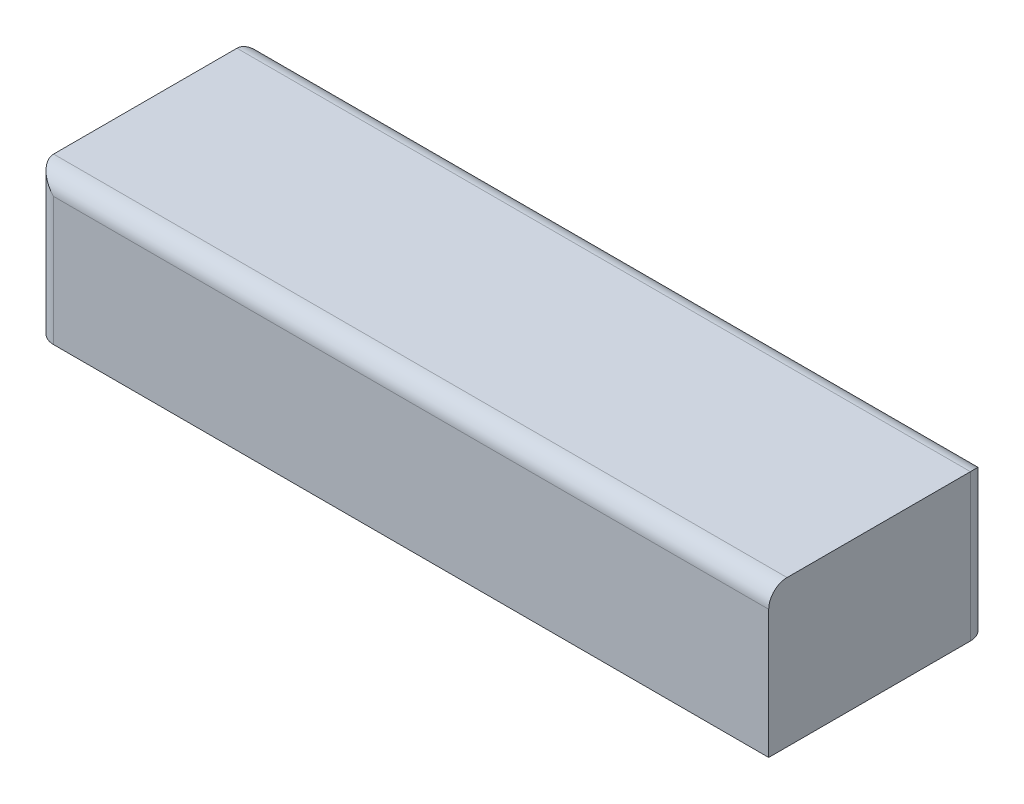
ISO-10303-21;
HEADER;
FILE_DESCRIPTION(('STEP AP214'),'2;1');
FILE_NAME('part.step','',(''),(''),'','','');
FILE_SCHEMA(('AUTOMOTIVE_DESIGN { 1 0 10303 214 1 1 1 1 }'));
ENDSEC;
DATA;
#1=APPLICATION_CONTEXT('core data for automotive mechanical design processes');
#2=APPLICATION_PROTOCOL_DEFINITION('international standard','automotive_design',2000,#1);
#3=PRODUCT_CONTEXT('',#1,'mechanical');
#4=PRODUCT('Part','Part','',(#3));
#5=PRODUCT_RELATED_PRODUCT_CATEGORY('part','',(#4));
#6=PRODUCT_DEFINITION_FORMATION('','',#4);
#7=PRODUCT_DEFINITION_CONTEXT('part definition',#1,'design');
#8=PRODUCT_DEFINITION('design','',#6,#7);
#9=PRODUCT_DEFINITION_SHAPE('','',#8);
#10=(LENGTH_UNIT() NAMED_UNIT(*) SI_UNIT(.MILLI.,.METRE.));
#11=(NAMED_UNIT(*) PLANE_ANGLE_UNIT() SI_UNIT($,.RADIAN.));
#12=(NAMED_UNIT(*) SI_UNIT($,.STERADIAN.) SOLID_ANGLE_UNIT());
#13=UNCERTAINTY_MEASURE_WITH_UNIT(LENGTH_MEASURE(1.E-05),#10,'distance_accuracy_value','');
#14=(GEOMETRIC_REPRESENTATION_CONTEXT(3) GLOBAL_UNCERTAINTY_ASSIGNED_CONTEXT((#13)) GLOBAL_UNIT_ASSIGNED_CONTEXT((#10,
#11,#12)) REPRESENTATION_CONTEXT('',''));
#15=CARTESIAN_POINT('',(0.,0.,0.));
#16=DIRECTION('',(0.,0.,1.));
#17=DIRECTION('',(1.,0.,0.));
#18=AXIS2_PLACEMENT_3D('',#15,#16,#17);
#19=CARTESIAN_POINT('',(0.,8.,0.));
#20=DIRECTION('',(1.,0.,0.));
#21=DIRECTION('',(0.,0.,-1.));
#22=AXIS2_PLACEMENT_3D('',#19,#20,#21);
#23=PLANE('',#22);
#24=DIRECTION('',(0.,0.,1.));
#25=VECTOR('',#24,1.);
#26=CARTESIAN_POINT('',(0.,0.,0.));
#27=LINE('',#26,#25);
#28=CARTESIAN_POINT('',(0.,0.,-11.));
#29=VERTEX_POINT('',#28);
#30=CARTESIAN_POINT('',(0.,0.,-1.));
#31=VERTEX_POINT('',#30);
#32=EDGE_CURVE('E113',#29,#31,#27,.T.);
#33=ORIENTED_EDGE('',*,*,#32,.T.);
#34=DIRECTION('',(0.,-1.,0.));
#35=VECTOR('',#34,1.);
#36=CARTESIAN_POINT('',(0.,8.,-1.));
#37=LINE('',#36,#35);
#38=CARTESIAN_POINT('',(0.,8.,-1.));
#39=VERTEX_POINT('',#38);
#40=EDGE_CURVE('E152',#31,#39,#37,.F.);
#41=ORIENTED_EDGE('',*,*,#40,.T.);
#42=DIRECTION('',(0.,0.,1.));
#43=VECTOR('',#42,1.);
#44=CARTESIAN_POINT('',(0.,8.,0.));
#45=LINE('',#44,#43);
#46=CARTESIAN_POINT('',(0.,8.,-11.));
#47=VERTEX_POINT('',#46);
#48=EDGE_CURVE('E130',#47,#39,#45,.T.);
#49=ORIENTED_EDGE('',*,*,#48,.F.);
#50=DIRECTION('',(0.,-1.,0.));
#51=VECTOR('',#50,1.);
#52=CARTESIAN_POINT('',(0.,8.,-11.));
#53=LINE('',#52,#51);
#54=EDGE_CURVE('E149',#47,#29,#53,.T.);
#55=ORIENTED_EDGE('',*,*,#54,.T.);
#56=EDGE_LOOP('',(#33,#41,#49,#55));
#57=FACE_BOUND('',#56,.T.);
#58=ADVANCED_FACE('F41',(#57),#23,.F.);
#59=CARTESIAN_POINT('',(0.,8.,0.));
#60=DIRECTION('',(0.,0.,-1.));
#61=DIRECTION('',(-1.,0.,0.));
#62=AXIS2_PLACEMENT_3D('',#59,#60,#61);
#63=PLANE('',#62);
#64=DIRECTION('',(0.,-1.,0.));
#65=VECTOR('',#64,1.);
#66=CARTESIAN_POINT('',(40.,8.,0.));
#67=LINE('',#66,#65);
#68=CARTESIAN_POINT('',(40.,7.,0.));
#69=VERTEX_POINT('',#68);
#70=CARTESIAN_POINT('',(40.,0.,0.));
#71=VERTEX_POINT('',#70);
#72=EDGE_CURVE('E105',#69,#71,#67,.T.);
#73=ORIENTED_EDGE('',*,*,#72,.F.);
#74=DIRECTION('',(1.,0.,0.));
#75=VECTOR('',#74,1.);
#76=CARTESIAN_POINT('',(0.,7.,0.));
#77=LINE('',#76,#75);
#78=CARTESIAN_POINT('',(1.,7.,0.));
#79=VERTEX_POINT('',#78);
#80=EDGE_CURVE('E142',#69,#79,#77,.F.);
#81=ORIENTED_EDGE('',*,*,#80,.T.);
#82=DIRECTION('',(0.,-1.,0.));
#83=VECTOR('',#82,1.);
#84=CARTESIAN_POINT('',(1.,8.,0.));
#85=LINE('',#84,#83);
#86=CARTESIAN_POINT('',(1.,0.,0.));
#87=VERTEX_POINT('',#86);
#88=EDGE_CURVE('E108',#79,#87,#85,.T.);
#89=ORIENTED_EDGE('',*,*,#88,.T.);
#90=DIRECTION('',(1.,0.,0.));
#91=VECTOR('',#90,1.);
#92=CARTESIAN_POINT('',(0.,0.,0.));
#93=LINE('',#92,#91);
#94=EDGE_CURVE('E102',#87,#71,#93,.T.);
#95=ORIENTED_EDGE('',*,*,#94,.T.);
#96=EDGE_LOOP('',(#73,#81,#89,#95));
#97=FACE_BOUND('',#96,.T.);
#98=ADVANCED_FACE('F104',(#97),#63,.F.);
#99=CARTESIAN_POINT('',(40.,8.,0.));
#100=DIRECTION('',(-1.,0.,0.));
#101=DIRECTION('',(0.,0.,1.));
#102=AXIS2_PLACEMENT_3D('',#99,#100,#101);
#103=PLANE('',#102);
#104=DIRECTION('',(0.,0.,-1.));
#105=VECTOR('',#104,1.);
#106=CARTESIAN_POINT('',(40.,8.,0.));
#107=LINE('',#106,#105);
#108=CARTESIAN_POINT('',(40.,8.,-1.));
#109=VERTEX_POINT('',#108);
#110=CARTESIAN_POINT('',(40.,8.,-11.));
#111=VERTEX_POINT('',#110);
#112=EDGE_CURVE('E122',#109,#111,#107,.T.);
#113=ORIENTED_EDGE('',*,*,#112,.F.);
#114=CARTESIAN_POINT('',(40.,7.,-1.));
#115=DIRECTION('',(-1.,0.,0.));
#116=DIRECTION('',(0.,0.,1.));
#117=AXIS2_PLACEMENT_3D('',#114,#115,#116);
#118=CIRCLE('',#117,1.);
#119=EDGE_CURVE('E120',#109,#69,#118,.F.);
#120=ORIENTED_EDGE('',*,*,#119,.T.);
#121=ORIENTED_EDGE('',*,*,#72,.T.);
#122=DIRECTION('',(0.,0.,-1.));
#123=VECTOR('',#122,1.);
#124=CARTESIAN_POINT('',(40.,0.,0.));
#125=LINE('',#124,#123);
#126=CARTESIAN_POINT('',(40.,0.,-11.));
#127=VERTEX_POINT('',#126);
#128=EDGE_CURVE('E112',#71,#127,#125,.T.);
#129=ORIENTED_EDGE('',*,*,#128,.T.);
#130=DIRECTION('',(0.,-1.,0.));
#131=VECTOR('',#130,1.);
#132=CARTESIAN_POINT('',(40.,8.,-11.));
#133=LINE('',#132,#131);
#134=EDGE_CURVE('E138',#127,#111,#133,.F.);
#135=ORIENTED_EDGE('',*,*,#134,.T.);
#136=EDGE_LOOP('',(#113,#120,#121,#129,#135));
#137=FACE_BOUND('',#136,.T.);
#138=ADVANCED_FACE('F118',(#137),#103,.F.);
#139=CARTESIAN_POINT('',(0.,8.,-12.));
#140=DIRECTION('',(0.,0.,1.));
#141=DIRECTION('',(1.,0.,0.));
#142=AXIS2_PLACEMENT_3D('',#139,#140,#141);
#143=PLANE('',#142);
#144=DIRECTION('',(-1.,0.,0.));
#145=VECTOR('',#144,1.);
#146=CARTESIAN_POINT('',(0.,0.,-12.));
#147=LINE('',#146,#145);
#148=CARTESIAN_POINT('',(39.,0.,-12.));
#149=VERTEX_POINT('',#148);
#150=CARTESIAN_POINT('',(1.,0.,-12.));
#151=VERTEX_POINT('',#150);
#152=EDGE_CURVE('E128',#149,#151,#147,.T.);
#153=ORIENTED_EDGE('',*,*,#152,.T.);
#154=DIRECTION('',(0.,-1.,0.));
#155=VECTOR('',#154,1.);
#156=CARTESIAN_POINT('',(1.,8.,-12.));
#157=LINE('',#156,#155);
#158=CARTESIAN_POINT('',(1.,7.,-12.));
#159=VERTEX_POINT('',#158);
#160=EDGE_CURVE('E11',#151,#159,#157,.F.);
#161=ORIENTED_EDGE('',*,*,#160,.T.);
#162=DIRECTION('',(-1.,0.,0.));
#163=VECTOR('',#162,1.);
#164=CARTESIAN_POINT('',(0.,7.,-12.));
#165=LINE('',#164,#163);
#166=CARTESIAN_POINT('',(39.,7.,-12.));
#167=VERTEX_POINT('',#166);
#168=EDGE_CURVE('E57',#159,#167,#165,.F.);
#169=ORIENTED_EDGE('',*,*,#168,.T.);
#170=DIRECTION('',(0.,-1.,0.));
#171=VECTOR('',#170,1.);
#172=CARTESIAN_POINT('',(39.,8.,-12.));
#173=LINE('',#172,#171);
#174=EDGE_CURVE('E50',#167,#149,#173,.T.);
#175=ORIENTED_EDGE('',*,*,#174,.T.);
#176=EDGE_LOOP('',(#153,#161,#169,#175));
#177=FACE_BOUND('',#176,.T.);
#178=ADVANCED_FACE('F169',(#177),#143,.F.);
#179=CARTESIAN_POINT('',(0.,8.,0.));
#180=DIRECTION('',(0.,-1.,0.));
#181=DIRECTION('',(0.,0.,-1.));
#182=AXIS2_PLACEMENT_3D('',#179,#180,#181);
#183=PLANE('',#182);
#184=ORIENTED_EDGE('',*,*,#48,.T.);
#185=DIRECTION('',(1.,0.,0.));
#186=VECTOR('',#185,1.);
#187=CARTESIAN_POINT('',(0.,8.,-1.));
#188=LINE('',#187,#186);
#189=EDGE_CURVE('E135',#39,#109,#188,.T.);
#190=ORIENTED_EDGE('',*,*,#189,.T.);
#191=ORIENTED_EDGE('',*,*,#112,.T.);
#192=DIRECTION('',(-1.,0.,0.));
#193=VECTOR('',#192,1.);
#194=CARTESIAN_POINT('',(0.,8.,-11.));
#195=LINE('',#194,#193);
#196=EDGE_CURVE('E121',#111,#47,#195,.T.);
#197=ORIENTED_EDGE('',*,*,#196,.T.);
#198=EDGE_LOOP('',(#184,#190,#191,#197));
#199=FACE_BOUND('',#198,.T.);
#200=ADVANCED_FACE('F182',(#199),#183,.F.);
#201=CARTESIAN_POINT('',(0.,0.,0.));
#202=DIRECTION('',(0.,-1.,0.));
#203=DIRECTION('',(0.,0.,-1.));
#204=AXIS2_PLACEMENT_3D('',#201,#202,#203);
#205=PLANE('',#204);
#206=ORIENTED_EDGE('',*,*,#94,.F.);
#207=CARTESIAN_POINT('',(1.,0.,-1.));
#208=DIRECTION('',(0.,-1.,0.));
#209=DIRECTION('',(0.,0.,-1.));
#210=AXIS2_PLACEMENT_3D('',#207,#208,#209);
#211=CIRCLE('',#210,1.);
#212=EDGE_CURVE('E147',#87,#31,#211,.T.);
#213=ORIENTED_EDGE('',*,*,#212,.T.);
#214=ORIENTED_EDGE('',*,*,#32,.F.);
#215=CARTESIAN_POINT('',(1.,0.,-11.));
#216=DIRECTION('',(0.,-1.,0.));
#217=DIRECTION('',(0.,0.,-1.));
#218=AXIS2_PLACEMENT_3D('',#215,#216,#217);
#219=CIRCLE('',#218,1.);
#220=EDGE_CURVE('E145',#29,#151,#219,.T.);
#221=ORIENTED_EDGE('',*,*,#220,.T.);
#222=ORIENTED_EDGE('',*,*,#152,.F.);
#223=CARTESIAN_POINT('',(39.,0.,-11.));
#224=DIRECTION('',(0.,-1.,0.));
#225=DIRECTION('',(0.,0.,-1.));
#226=AXIS2_PLACEMENT_3D('',#223,#224,#225);
#227=CIRCLE('',#226,1.);
#228=EDGE_CURVE('E127',#149,#127,#227,.T.);
#229=ORIENTED_EDGE('',*,*,#228,.T.);
#230=ORIENTED_EDGE('',*,*,#128,.F.);
#231=EDGE_LOOP('',(#206,#213,#214,#221,#222,#229,#230));
#232=FACE_BOUND('',#231,.T.);
#233=ADVANCED_FACE('F124',(#232),#205,.T.);
#234=CARTESIAN_POINT('',(1.,8.,-1.));
#235=DIRECTION('',(0.,-1.,0.));
#236=DIRECTION('',(0.,0.,-1.));
#237=AXIS2_PLACEMENT_3D('',#234,#235,#236);
#238=CYLINDRICAL_SURFACE('',#237,1.);
#239=ORIENTED_EDGE('',*,*,#212,.F.);
#240=ORIENTED_EDGE('',*,*,#88,.F.);
#241=CARTESIAN_POINT('',(1.,7.,-1.));
#242=DIRECTION('',(-0.707106781186547,-0.707106781186547,0.));
#243=DIRECTION('',(0.707106781186547,-0.707106781186547,0.));
#244=AXIS2_PLACEMENT_3D('',#241,#242,#243);
#245=ELLIPSE('',#244,1.41421356237309,1.);
#246=EDGE_CURVE('E156',#39,#79,#245,.F.);
#247=ORIENTED_EDGE('',*,*,#246,.F.);
#248=ORIENTED_EDGE('',*,*,#40,.F.);
#249=EDGE_LOOP('',(#239,#240,#247,#248));
#250=FACE_BOUND('',#249,.T.);
#251=ADVANCED_FACE('F187',(#250),#238,.T.);
#252=CARTESIAN_POINT('',(0.,7.,-1.));
#253=DIRECTION('',(1.,0.,0.));
#254=DIRECTION('',(0.,0.,-1.));
#255=AXIS2_PLACEMENT_3D('',#252,#253,#254);
#256=CYLINDRICAL_SURFACE('',#255,1.);
#257=ORIENTED_EDGE('',*,*,#246,.T.);
#258=ORIENTED_EDGE('',*,*,#80,.F.);
#259=ORIENTED_EDGE('',*,*,#119,.F.);
#260=ORIENTED_EDGE('',*,*,#189,.F.);
#261=EDGE_LOOP('',(#257,#258,#259,#260));
#262=FACE_BOUND('',#261,.T.);
#263=ADVANCED_FACE('F185',(#262),#256,.T.);
#264=CARTESIAN_POINT('',(39.,8.,-11.));
#265=DIRECTION('',(0.,-1.,0.));
#266=DIRECTION('',(0.,0.,-1.));
#267=AXIS2_PLACEMENT_3D('',#264,#265,#266);
#268=CYLINDRICAL_SURFACE('',#267,1.);
#269=ORIENTED_EDGE('',*,*,#228,.F.);
#270=ORIENTED_EDGE('',*,*,#174,.F.);
#271=CARTESIAN_POINT('',(39.,7.,-11.));
#272=DIRECTION('',(-0.707106781186547,0.707106781186547,0.));
#273=DIRECTION('',(-0.707106781186547,-0.707106781186547,0.));
#274=AXIS2_PLACEMENT_3D('',#271,#272,#273);
#275=ELLIPSE('',#274,1.41421356237309,1.);
#276=EDGE_CURVE('E45',#111,#167,#275,.T.);
#277=ORIENTED_EDGE('',*,*,#276,.F.);
#278=ORIENTED_EDGE('',*,*,#134,.F.);
#279=EDGE_LOOP('',(#269,#270,#277,#278));
#280=FACE_BOUND('',#279,.T.);
#281=ADVANCED_FACE('F43',(#280),#268,.T.);
#282=CARTESIAN_POINT('',(0.,7.,-11.));
#283=DIRECTION('',(-1.,0.,0.));
#284=DIRECTION('',(0.,0.,1.));
#285=AXIS2_PLACEMENT_3D('',#282,#283,#284);
#286=CYLINDRICAL_SURFACE('',#285,1.);
#287=ORIENTED_EDGE('',*,*,#276,.T.);
#288=ORIENTED_EDGE('',*,*,#168,.F.);
#289=CARTESIAN_POINT('',(1.,7.,-11.));
#290=DIRECTION('',(-0.707106781186547,-0.707106781186547,0.));
#291=DIRECTION('',(-0.707106781186547,0.707106781186547,0.));
#292=AXIS2_PLACEMENT_3D('',#289,#290,#291);
#293=ELLIPSE('',#292,1.41421356237309,1.);
#294=EDGE_CURVE('E158',#47,#159,#293,.T.);
#295=ORIENTED_EDGE('',*,*,#294,.F.);
#296=ORIENTED_EDGE('',*,*,#196,.F.);
#297=EDGE_LOOP('',(#287,#288,#295,#296));
#298=FACE_BOUND('',#297,.T.);
#299=ADVANCED_FACE('F167',(#298),#286,.T.);
#300=CARTESIAN_POINT('',(1.,8.,-11.));
#301=DIRECTION('',(0.,-1.,0.));
#302=DIRECTION('',(0.,0.,-1.));
#303=AXIS2_PLACEMENT_3D('',#300,#301,#302);
#304=CYLINDRICAL_SURFACE('',#303,1.);
#305=ORIENTED_EDGE('',*,*,#294,.T.);
#306=ORIENTED_EDGE('',*,*,#160,.F.);
#307=ORIENTED_EDGE('',*,*,#220,.F.);
#308=ORIENTED_EDGE('',*,*,#54,.F.);
#309=EDGE_LOOP('',(#305,#306,#307,#308));
#310=FACE_BOUND('',#309,.T.);
#311=ADVANCED_FACE('F172',(#310),#304,.T.);
#312=CLOSED_SHELL('',(#58,#98,#138,#178,#200,#233,#251,#263,#281,#299,#311));
#313=MANIFOLD_SOLID_BREP('B2',#312);
#314=ADVANCED_BREP_SHAPE_REPRESENTATION('',(#18,#313),#14);
#315=SHAPE_DEFINITION_REPRESENTATION(#9,#314);
ENDSEC;
END-ISO-10303-21;
